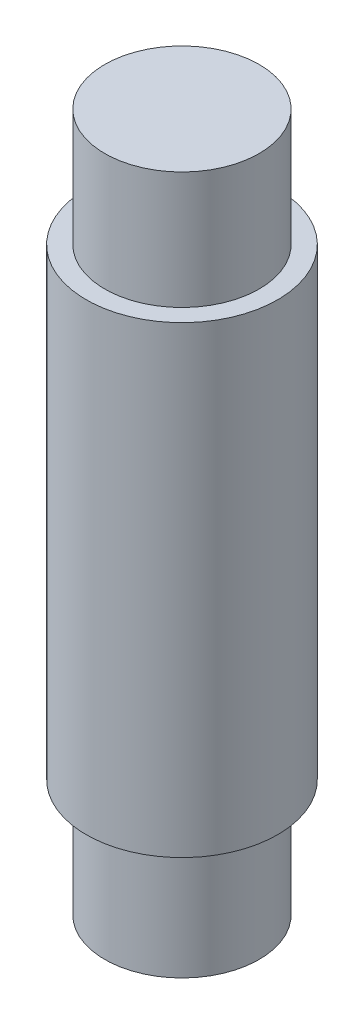
ISO-10303-21;
HEADER;
FILE_DESCRIPTION(('STEP AP214'),'2;1');
FILE_NAME('part.step','',(''),(''),'','','');
FILE_SCHEMA(('AUTOMOTIVE_DESIGN { 1 0 10303 214 1 1 1 1 }'));
ENDSEC;
DATA;
#1=APPLICATION_CONTEXT('core data for automotive mechanical design processes');
#2=APPLICATION_PROTOCOL_DEFINITION('international standard','automotive_design',2000,#1);
#3=PRODUCT_CONTEXT('',#1,'mechanical');
#4=PRODUCT('Part','Part','',(#3));
#5=PRODUCT_RELATED_PRODUCT_CATEGORY('part','',(#4));
#6=PRODUCT_DEFINITION_FORMATION('','',#4);
#7=PRODUCT_DEFINITION_CONTEXT('part definition',#1,'design');
#8=PRODUCT_DEFINITION('design','',#6,#7);
#9=PRODUCT_DEFINITION_SHAPE('','',#8);
#10=(LENGTH_UNIT() NAMED_UNIT(*) SI_UNIT(.MILLI.,.METRE.));
#11=(NAMED_UNIT(*) PLANE_ANGLE_UNIT() SI_UNIT($,.RADIAN.));
#12=(NAMED_UNIT(*) SI_UNIT($,.STERADIAN.) SOLID_ANGLE_UNIT());
#13=UNCERTAINTY_MEASURE_WITH_UNIT(LENGTH_MEASURE(1.E-05),#10,'distance_accuracy_value','');
#14=(GEOMETRIC_REPRESENTATION_CONTEXT(3) GLOBAL_UNCERTAINTY_ASSIGNED_CONTEXT((#13)) GLOBAL_UNIT_ASSIGNED_CONTEXT((#10,
#11,#12)) REPRESENTATION_CONTEXT('',''));
#15=CARTESIAN_POINT('',(0.,0.,0.));
#16=DIRECTION('',(0.,0.,1.));
#17=DIRECTION('',(1.,0.,0.));
#18=AXIS2_PLACEMENT_3D('',#15,#16,#17);
#19=CARTESIAN_POINT('',(-3.175,0.,0.));
#20=DIRECTION('',(0.,1.,0.));
#21=DIRECTION('',(0.,0.,1.));
#22=AXIS2_PLACEMENT_3D('',#19,#20,#21);
#23=PLANE('',#22);
#24=CARTESIAN_POINT('',(-3.175,0.,0.));
#25=DIRECTION('',(0.,-1.,0.));
#26=DIRECTION('',(0.,0.,-1.));
#27=AXIS2_PLACEMENT_3D('',#24,#25,#26);
#28=CIRCLE('',#27,3.175);
#29=CARTESIAN_POINT('',(-3.175,0.,-3.175));
#30=VERTEX_POINT('',#29);
#31=EDGE_CURVE('E10',#30,#30,#28,.T.);
#32=ORIENTED_EDGE('',*,*,#31,.F.);
#33=EDGE_LOOP('',(#32));
#34=FACE_BOUND('',#33,.T.);
#35=ADVANCED_FACE('F31',(#34),#23,.T.);
#36=CARTESIAN_POINT('',(-3.175,-28.702,0.));
#37=DIRECTION('',(0.,-1.,0.));
#38=DIRECTION('',(0.,0.,-1.));
#39=AXIS2_PLACEMENT_3D('',#36,#37,#38);
#40=CYLINDRICAL_SURFACE('',#39,3.175);
#41=ORIENTED_EDGE('',*,*,#31,.T.);
#42=EDGE_LOOP('',(#41));
#43=FACE_BOUND('',#42,.T.);
#44=CARTESIAN_POINT('',(-3.175,-4.826,0.));
#45=DIRECTION('',(0.,-1.,0.));
#46=DIRECTION('',(0.,0.,-1.));
#47=AXIS2_PLACEMENT_3D('',#44,#45,#46);
#48=CIRCLE('',#47,3.175);
#49=CARTESIAN_POINT('',(-3.175,-4.826,-3.175));
#50=VERTEX_POINT('',#49);
#51=EDGE_CURVE('E37',#50,#50,#48,.T.);
#52=ORIENTED_EDGE('',*,*,#51,.F.);
#53=EDGE_LOOP('',(#52));
#54=FACE_BOUND('',#53,.T.);
#55=ADVANCED_FACE('F73',(#43,#54),#40,.T.);
#56=CARTESIAN_POINT('',(0.,-4.826,0.));
#57=DIRECTION('',(0.,1.,0.));
#58=DIRECTION('',(0.,0.,1.));
#59=AXIS2_PLACEMENT_3D('',#56,#57,#58);
#60=PLANE('',#59);
#61=ORIENTED_EDGE('',*,*,#51,.T.);
#62=EDGE_LOOP('',(#61));
#63=FACE_BOUND('',#62,.T.);
#64=CARTESIAN_POINT('',(-3.175,-4.826,0.));
#65=DIRECTION('',(0.,-1.,0.));
#66=DIRECTION('',(0.,0.,-1.));
#67=AXIS2_PLACEMENT_3D('',#64,#65,#66);
#68=CIRCLE('',#67,3.937);
#69=CARTESIAN_POINT('',(-3.175,-4.826,-3.937));
#70=VERTEX_POINT('',#69);
#71=EDGE_CURVE('E41',#70,#70,#68,.T.);
#72=ORIENTED_EDGE('',*,*,#71,.F.);
#73=EDGE_LOOP('',(#72));
#74=FACE_BOUND('',#73,.T.);
#75=ADVANCED_FACE('F78',(#63,#74),#60,.T.);
#76=CARTESIAN_POINT('',(-3.175,-28.702,0.));
#77=DIRECTION('',(0.,-1.,0.));
#78=DIRECTION('',(0.,0.,-1.));
#79=AXIS2_PLACEMENT_3D('',#76,#77,#78);
#80=CYLINDRICAL_SURFACE('',#79,3.937);
#81=ORIENTED_EDGE('',*,*,#71,.T.);
#82=EDGE_LOOP('',(#81));
#83=FACE_BOUND('',#82,.T.);
#84=CARTESIAN_POINT('',(-3.175,-23.876,0.));
#85=DIRECTION('',(0.,-1.,0.));
#86=DIRECTION('',(0.,0.,-1.));
#87=AXIS2_PLACEMENT_3D('',#84,#85,#86);
#88=CIRCLE('',#87,3.937);
#89=CARTESIAN_POINT('',(-3.175,-23.876,-3.937));
#90=VERTEX_POINT('',#89);
#91=EDGE_CURVE('E45',#90,#90,#88,.T.);
#92=ORIENTED_EDGE('',*,*,#91,.F.);
#93=EDGE_LOOP('',(#92));
#94=FACE_BOUND('',#93,.T.);
#95=ADVANCED_FACE('F69',(#83,#94),#80,.T.);
#96=CARTESIAN_POINT('',(0.762000000000004,-23.876,0.));
#97=DIRECTION('',(0.,-1.,0.));
#98=DIRECTION('',(0.,0.,-1.));
#99=AXIS2_PLACEMENT_3D('',#96,#97,#98);
#100=PLANE('',#99);
#101=ORIENTED_EDGE('',*,*,#91,.T.);
#102=EDGE_LOOP('',(#101));
#103=FACE_BOUND('',#102,.T.);
#104=CARTESIAN_POINT('',(-3.175,-23.876,0.));
#105=DIRECTION('',(0.,-1.,0.));
#106=DIRECTION('',(0.,0.,-1.));
#107=AXIS2_PLACEMENT_3D('',#104,#105,#106);
#108=CIRCLE('',#107,3.175);
#109=CARTESIAN_POINT('',(-3.175,-23.876,-3.175));
#110=VERTEX_POINT('',#109);
#111=EDGE_CURVE('E50',#110,#110,#108,.T.);
#112=ORIENTED_EDGE('',*,*,#111,.F.);
#113=EDGE_LOOP('',(#112));
#114=FACE_BOUND('',#113,.T.);
#115=ADVANCED_FACE('F61',(#103,#114),#100,.T.);
#116=CARTESIAN_POINT('',(-3.175,-28.702,0.));
#117=DIRECTION('',(0.,-1.,0.));
#118=DIRECTION('',(0.,0.,-1.));
#119=AXIS2_PLACEMENT_3D('',#116,#117,#118);
#120=CYLINDRICAL_SURFACE('',#119,3.175);
#121=ORIENTED_EDGE('',*,*,#111,.T.);
#122=EDGE_LOOP('',(#121));
#123=FACE_BOUND('',#122,.T.);
#124=CARTESIAN_POINT('',(-3.175,-28.702,0.));
#125=DIRECTION('',(0.,-1.,0.));
#126=DIRECTION('',(0.,0.,-1.));
#127=AXIS2_PLACEMENT_3D('',#124,#125,#126);
#128=CIRCLE('',#127,3.175);
#129=CARTESIAN_POINT('',(-3.175,-28.702,-3.175));
#130=VERTEX_POINT('',#129);
#131=EDGE_CURVE('E53',#130,#130,#128,.T.);
#132=ORIENTED_EDGE('',*,*,#131,.F.);
#133=EDGE_LOOP('',(#132));
#134=FACE_BOUND('',#133,.T.);
#135=ADVANCED_FACE('F59',(#123,#134),#120,.T.);
#136=CARTESIAN_POINT('',(0.,-28.702,0.));
#137=DIRECTION('',(0.,-1.,0.));
#138=DIRECTION('',(0.,0.,-1.));
#139=AXIS2_PLACEMENT_3D('',#136,#137,#138);
#140=PLANE('',#139);
#141=ORIENTED_EDGE('',*,*,#131,.T.);
#142=EDGE_LOOP('',(#141));
#143=FACE_BOUND('',#142,.T.);
#144=ADVANCED_FACE('F57',(#143),#140,.T.);
#145=CLOSED_SHELL('',(#35,#55,#75,#95,#115,#135,#144));
#146=MANIFOLD_SOLID_BREP('B2',#145);
#147=ADVANCED_BREP_SHAPE_REPRESENTATION('',(#18,#146),#14);
#148=SHAPE_DEFINITION_REPRESENTATION(#9,#147);
ENDSEC;
END-ISO-10303-21;
